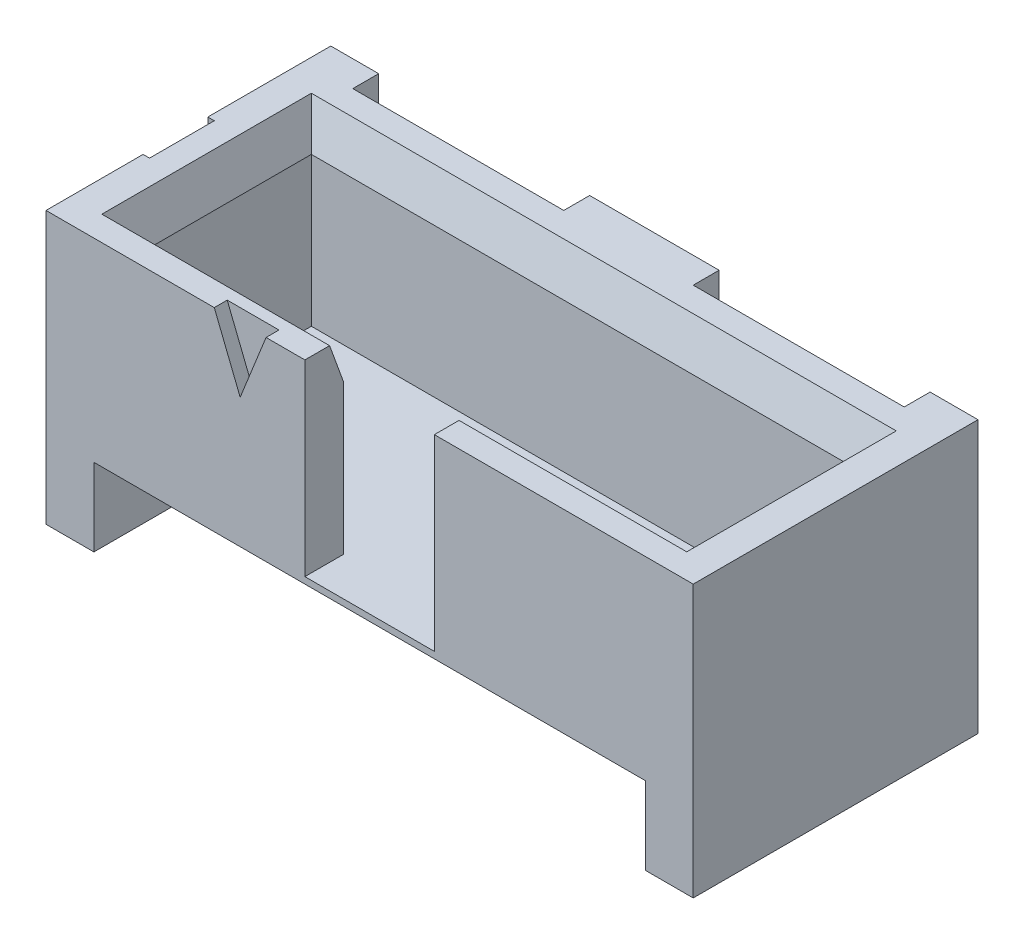
ISO-10303-21;
HEADER;
FILE_DESCRIPTION(('STEP AP214'),'2;1');
FILE_NAME('part.step','',(''),(''),'','','');
FILE_SCHEMA(('AUTOMOTIVE_DESIGN { 1 0 10303 214 1 1 1 1 }'));
ENDSEC;
DATA;
#1=APPLICATION_CONTEXT('core data for automotive mechanical design processes');
#2=APPLICATION_PROTOCOL_DEFINITION('international standard','automotive_design',2000,#1);
#3=PRODUCT_CONTEXT('',#1,'mechanical');
#4=PRODUCT('Part','Part','',(#3));
#5=PRODUCT_RELATED_PRODUCT_CATEGORY('part','',(#4));
#6=PRODUCT_DEFINITION_FORMATION('','',#4);
#7=PRODUCT_DEFINITION_CONTEXT('part definition',#1,'design');
#8=PRODUCT_DEFINITION('design','',#6,#7);
#9=PRODUCT_DEFINITION_SHAPE('','',#8);
#10=(LENGTH_UNIT() NAMED_UNIT(*) SI_UNIT(.MILLI.,.METRE.));
#11=(NAMED_UNIT(*) PLANE_ANGLE_UNIT() SI_UNIT($,.RADIAN.));
#12=(NAMED_UNIT(*) SI_UNIT($,.STERADIAN.) SOLID_ANGLE_UNIT());
#13=UNCERTAINTY_MEASURE_WITH_UNIT(LENGTH_MEASURE(1.E-05),#10,'distance_accuracy_value','');
#14=(GEOMETRIC_REPRESENTATION_CONTEXT(3) GLOBAL_UNCERTAINTY_ASSIGNED_CONTEXT((#13)) GLOBAL_UNIT_ASSIGNED_CONTEXT((#10,
#11,#12)) REPRESENTATION_CONTEXT('',''));
#15=CARTESIAN_POINT('',(0.,0.,0.));
#16=DIRECTION('',(0.,0.,1.));
#17=DIRECTION('',(1.,0.,0.));
#18=AXIS2_PLACEMENT_3D('',#15,#16,#17);
#19=CARTESIAN_POINT('',(-1.27,5.334,-3.048));
#20=DIRECTION('',(1.,0.,0.));
#21=DIRECTION('',(0.,0.,-1.));
#22=AXIS2_PLACEMENT_3D('',#19,#20,#21);
#23=PLANE('',#22);
#24=DIRECTION('',(0.,-0.707106781186548,0.707106781186548));
#25=VECTOR('',#24,1.);
#26=CARTESIAN_POINT('',(-1.27,2.032,-3.048));
#27=LINE('',#26,#25);
#28=CARTESIAN_POINT('',(-1.27,2.032,-3.048));
#29=VERTEX_POINT('',#28);
#30=CARTESIAN_POINT('',(-1.27,1.524,-2.54));
#31=VERTEX_POINT('',#30);
#32=EDGE_CURVE('E11',#29,#31,#27,.T.);
#33=ORIENTED_EDGE('',*,*,#32,.T.);
#34=DIRECTION('',(0.,-1.,0.));
#35=VECTOR('',#34,1.);
#36=CARTESIAN_POINT('',(-1.27,5.334,-2.54));
#37=LINE('',#36,#35);
#38=CARTESIAN_POINT('',(-1.27,5.334,-2.54));
#39=VERTEX_POINT('',#38);
#40=EDGE_CURVE('E23',#39,#31,#37,.T.);
#41=ORIENTED_EDGE('',*,*,#40,.F.);
#42=DIRECTION('',(0.,0.,1.));
#43=VECTOR('',#42,1.);
#44=CARTESIAN_POINT('',(-1.27,5.334,-3.048));
#45=LINE('',#44,#43);
#46=CARTESIAN_POINT('',(-1.27,5.334,-3.048));
#47=VERTEX_POINT('',#46);
#48=EDGE_CURVE('E514',#47,#39,#45,.T.);
#49=ORIENTED_EDGE('',*,*,#48,.F.);
#50=DIRECTION('',(0.,-1.,0.));
#51=VECTOR('',#50,1.);
#52=CARTESIAN_POINT('',(-1.27,5.334,-3.048));
#53=LINE('',#52,#51);
#54=EDGE_CURVE('E512',#47,#29,#53,.T.);
#55=ORIENTED_EDGE('',*,*,#54,.T.);
#56=EDGE_LOOP('',(#33,#41,#49,#55));
#57=FACE_BOUND('',#56,.T.);
#58=ADVANCED_FACE('F16',(#57),#23,.F.);
#59=CARTESIAN_POINT('',(0.,0.,-3.048));
#60=DIRECTION('',(0.,0.,1.));
#61=DIRECTION('',(1.,0.,0.));
#62=AXIS2_PLACEMENT_3D('',#59,#60,#61);
#63=PLANE('',#62);
#64=DIRECTION('',(-1.,0.,0.));
#65=VECTOR('',#64,1.);
#66=CARTESIAN_POINT('',(5.4102,2.032,-3.048));
#67=LINE('',#66,#65);
#68=CARTESIAN_POINT('',(1.27,2.032,-3.048));
#69=VERTEX_POINT('',#68);
#70=EDGE_CURVE('E509',#69,#29,#67,.T.);
#71=ORIENTED_EDGE('',*,*,#70,.T.);
#72=ORIENTED_EDGE('',*,*,#54,.F.);
#73=DIRECTION('',(-1.,0.,0.));
#74=VECTOR('',#73,1.);
#75=CARTESIAN_POINT('',(6.35,5.334,-3.048));
#76=LINE('',#75,#74);
#77=CARTESIAN_POINT('',(1.27,5.334,-3.048));
#78=VERTEX_POINT('',#77);
#79=EDGE_CURVE('E506',#78,#47,#76,.T.);
#80=ORIENTED_EDGE('',*,*,#79,.F.);
#81=DIRECTION('',(0.,-1.,0.));
#82=VECTOR('',#81,1.);
#83=CARTESIAN_POINT('',(1.27,5.334,-3.048));
#84=LINE('',#83,#82);
#85=EDGE_CURVE('E503',#78,#69,#84,.T.);
#86=ORIENTED_EDGE('',*,*,#85,.T.);
#87=EDGE_LOOP('',(#71,#72,#80,#86));
#88=FACE_BOUND('',#87,.T.);
#89=ADVANCED_FACE('F641',(#88),#63,.F.);
#90=CARTESIAN_POINT('',(1.27,5.334,-2.54));
#91=DIRECTION('',(-1.,0.,0.));
#92=DIRECTION('',(0.,0.,1.));
#93=AXIS2_PLACEMENT_3D('',#90,#91,#92);
#94=PLANE('',#93);
#95=DIRECTION('',(0.,0.707106781186548,-0.707106781186548));
#96=VECTOR('',#95,1.);
#97=CARTESIAN_POINT('',(1.27,2.032,-3.048));
#98=LINE('',#97,#96);
#99=CARTESIAN_POINT('',(1.27,1.524,-2.54));
#100=VERTEX_POINT('',#99);
#101=EDGE_CURVE('E500',#100,#69,#98,.T.);
#102=ORIENTED_EDGE('',*,*,#101,.T.);
#103=ORIENTED_EDGE('',*,*,#85,.F.);
#104=DIRECTION('',(0.,0.,-1.));
#105=VECTOR('',#104,1.);
#106=CARTESIAN_POINT('',(1.27,5.334,-2.54));
#107=LINE('',#106,#105);
#108=CARTESIAN_POINT('',(1.27,5.334,-2.54));
#109=VERTEX_POINT('',#108);
#110=EDGE_CURVE('E497',#109,#78,#107,.T.);
#111=ORIENTED_EDGE('',*,*,#110,.F.);
#112=DIRECTION('',(0.,-1.,0.));
#113=VECTOR('',#112,1.);
#114=CARTESIAN_POINT('',(1.27,5.334,-2.54));
#115=LINE('',#114,#113);
#116=EDGE_CURVE('E494',#109,#100,#115,.T.);
#117=ORIENTED_EDGE('',*,*,#116,.T.);
#118=EDGE_LOOP('',(#102,#103,#111,#117));
#119=FACE_BOUND('',#118,.T.);
#120=ADVANCED_FACE('F645',(#119),#94,.F.);
#121=CARTESIAN_POINT('',(5.4102,5.334,-2.54));
#122=DIRECTION('',(0.,0.,1.));
#123=DIRECTION('',(1.,0.,0.));
#124=AXIS2_PLACEMENT_3D('',#121,#122,#123);
#125=PLANE('',#124);
#126=DIRECTION('',(-1.,0.,0.));
#127=VECTOR('',#126,1.);
#128=CARTESIAN_POINT('',(5.4102,1.524,-2.54));
#129=LINE('',#128,#127);
#130=CARTESIAN_POINT('',(5.4102,1.524,-2.54));
#131=VERTEX_POINT('',#130);
#132=EDGE_CURVE('E491',#131,#100,#129,.T.);
#133=ORIENTED_EDGE('',*,*,#132,.T.);
#134=ORIENTED_EDGE('',*,*,#116,.F.);
#135=DIRECTION('',(-1.,0.,0.));
#136=VECTOR('',#135,1.);
#137=CARTESIAN_POINT('',(5.4102,5.334,-2.54));
#138=LINE('',#137,#136);
#139=CARTESIAN_POINT('',(5.4102,5.334,-2.54));
#140=VERTEX_POINT('',#139);
#141=EDGE_CURVE('E488',#140,#109,#138,.T.);
#142=ORIENTED_EDGE('',*,*,#141,.F.);
#143=DIRECTION('',(0.,-1.,0.));
#144=VECTOR('',#143,1.);
#145=CARTESIAN_POINT('',(5.4102,5.334,-2.54));
#146=LINE('',#145,#144);
#147=EDGE_CURVE('E485',#140,#131,#146,.T.);
#148=ORIENTED_EDGE('',*,*,#147,.T.);
#149=EDGE_LOOP('',(#133,#134,#142,#148));
#150=FACE_BOUND('',#149,.T.);
#151=ADVANCED_FACE('F638',(#150),#125,.F.);
#152=CARTESIAN_POINT('',(5.4102,0.,0.));
#153=DIRECTION('',(1.,0.,0.));
#154=DIRECTION('',(0.,0.,-1.));
#155=AXIS2_PLACEMENT_3D('',#152,#153,#154);
#156=PLANE('',#155);
#157=DIRECTION('',(0.,-0.707106781186548,0.707106781186548));
#158=VECTOR('',#157,1.);
#159=CARTESIAN_POINT('',(5.4102,2.032,-3.048));
#160=LINE('',#159,#158);
#161=CARTESIAN_POINT('',(5.4102,0.508,-1.524));
#162=VERTEX_POINT('',#161);
#163=EDGE_CURVE('E483',#131,#162,#160,.T.);
#164=ORIENTED_EDGE('',*,*,#163,.F.);
#165=ORIENTED_EDGE('',*,*,#147,.F.);
#166=DIRECTION('',(0.,0.,1.));
#167=VECTOR('',#166,1.);
#168=CARTESIAN_POINT('',(5.4102,5.334,-3.048));
#169=LINE('',#168,#167);
#170=CARTESIAN_POINT('',(5.4102,5.334,-3.048));
#171=VERTEX_POINT('',#170);
#172=EDGE_CURVE('E480',#171,#140,#169,.T.);
#173=ORIENTED_EDGE('',*,*,#172,.F.);
#174=DIRECTION('',(0.,1.,0.));
#175=VECTOR('',#174,1.);
#176=CARTESIAN_POINT('',(5.4102,0.,-3.048));
#177=LINE('',#176,#175);
#178=CARTESIAN_POINT('',(5.4102,0.,-3.048));
#179=VERTEX_POINT('',#178);
#180=EDGE_CURVE('E477',#179,#171,#177,.T.);
#181=ORIENTED_EDGE('',*,*,#180,.F.);
#182=DIRECTION('',(0.,0.,-1.));
#183=VECTOR('',#182,1.);
#184=CARTESIAN_POINT('',(5.4102,0.,2.54));
#185=LINE('',#184,#183);
#186=CARTESIAN_POINT('',(5.4102,0.,2.54));
#187=VERTEX_POINT('',#186);
#188=EDGE_CURVE('E474',#187,#179,#185,.T.);
#189=ORIENTED_EDGE('',*,*,#188,.F.);
#190=DIRECTION('',(0.,-1.,0.));
#191=VECTOR('',#190,1.);
#192=CARTESIAN_POINT('',(5.4102,1.524,2.54));
#193=LINE('',#192,#191);
#194=CARTESIAN_POINT('',(5.4102,1.524,2.54));
#195=VERTEX_POINT('',#194);
#196=EDGE_CURVE('E471',#195,#187,#193,.T.);
#197=ORIENTED_EDGE('',*,*,#196,.F.);
#198=DIRECTION('',(0.,0.707106781186547,0.707106781186548));
#199=VECTOR('',#198,1.);
#200=CARTESIAN_POINT('',(5.4102,0.508,1.524));
#201=LINE('',#200,#199);
#202=CARTESIAN_POINT('',(5.4102,0.508,1.524));
#203=VERTEX_POINT('',#202);
#204=EDGE_CURVE('E468',#203,#195,#201,.T.);
#205=ORIENTED_EDGE('',*,*,#204,.F.);
#206=DIRECTION('',(0.,0.,1.));
#207=VECTOR('',#206,1.);
#208=CARTESIAN_POINT('',(5.4102,0.508,-1.524));
#209=LINE('',#208,#207);
#210=EDGE_CURVE('E465',#162,#203,#209,.T.);
#211=ORIENTED_EDGE('',*,*,#210,.F.);
#212=EDGE_LOOP('',(#164,#165,#173,#181,#189,#197,#205,#211));
#213=FACE_BOUND('',#212,.T.);
#214=ADVANCED_FACE('F620',(#213),#156,.F.);
#215=CARTESIAN_POINT('',(5.4102,0.508,-1.524));
#216=DIRECTION('',(0.,-1.,0.));
#217=DIRECTION('',(0.,0.,-1.));
#218=AXIS2_PLACEMENT_3D('',#215,#216,#217);
#219=PLANE('',#218);
#220=DIRECTION('',(0.,0.,1.));
#221=VECTOR('',#220,1.);
#222=CARTESIAN_POINT('',(-5.4102,0.508,-1.524));
#223=LINE('',#222,#221);
#224=CARTESIAN_POINT('',(-5.4102,0.508,-1.524));
#225=VERTEX_POINT('',#224);
#226=CARTESIAN_POINT('',(-5.4102,0.508,1.524));
#227=VERTEX_POINT('',#226);
#228=EDGE_CURVE('E463',#225,#227,#223,.T.);
#229=ORIENTED_EDGE('',*,*,#228,.F.);
#230=DIRECTION('',(-1.,0.,0.));
#231=VECTOR('',#230,1.);
#232=CARTESIAN_POINT('',(5.4102,0.508,-1.524));
#233=LINE('',#232,#231);
#234=EDGE_CURVE('E460',#162,#225,#233,.T.);
#235=ORIENTED_EDGE('',*,*,#234,.F.);
#236=ORIENTED_EDGE('',*,*,#210,.T.);
#237=DIRECTION('',(-1.,0.,0.));
#238=VECTOR('',#237,1.);
#239=CARTESIAN_POINT('',(5.4102,0.508,1.524));
#240=LINE('',#239,#238);
#241=EDGE_CURVE('E457',#203,#227,#240,.T.);
#242=ORIENTED_EDGE('',*,*,#241,.T.);
#243=EDGE_LOOP('',(#229,#235,#236,#242));
#244=FACE_BOUND('',#243,.T.);
#245=ADVANCED_FACE('F629',(#244),#219,.T.);
#246=CARTESIAN_POINT('',(5.4102,0.508,1.524));
#247=DIRECTION('',(0.,-0.707106781186548,0.707106781186548));
#248=DIRECTION('',(0.,-0.707106781186548,-0.707106781186548));
#249=AXIS2_PLACEMENT_3D('',#246,#247,#248);
#250=PLANE('',#249);
#251=DIRECTION('',(0.,0.707106781186547,0.707106781186548));
#252=VECTOR('',#251,1.);
#253=CARTESIAN_POINT('',(-5.4102,0.508,1.524));
#254=LINE('',#253,#252);
#255=CARTESIAN_POINT('',(-5.4102,1.524,2.54));
#256=VERTEX_POINT('',#255);
#257=EDGE_CURVE('E455',#227,#256,#254,.T.);
#258=ORIENTED_EDGE('',*,*,#257,.F.);
#259=ORIENTED_EDGE('',*,*,#241,.F.);
#260=ORIENTED_EDGE('',*,*,#204,.T.);
#261=DIRECTION('',(-1.,0.,0.));
#262=VECTOR('',#261,1.);
#263=CARTESIAN_POINT('',(5.4102,1.524,2.54));
#264=LINE('',#263,#262);
#265=EDGE_CURVE('E452',#195,#256,#264,.T.);
#266=ORIENTED_EDGE('',*,*,#265,.T.);
#267=EDGE_LOOP('',(#258,#259,#260,#266));
#268=FACE_BOUND('',#267,.T.);
#269=ADVANCED_FACE('F625',(#268),#250,.T.);
#270=CARTESIAN_POINT('',(0.,0.,2.54));
#271=DIRECTION('',(0.,0.,1.));
#272=DIRECTION('',(1.,0.,0.));
#273=AXIS2_PLACEMENT_3D('',#270,#271,#272);
#274=PLANE('',#273);
#275=DIRECTION('',(0.371390676354104,-0.928476690885259,0.));
#276=VECTOR('',#275,1.);
#277=CARTESIAN_POINT('',(-3.048,5.334,2.54));
#278=LINE('',#277,#276);
#279=CARTESIAN_POINT('',(-3.048,5.334,2.54));
#280=VERTEX_POINT('',#279);
#281=CARTESIAN_POINT('',(-2.54,4.064,2.54));
#282=VERTEX_POINT('',#281);
#283=EDGE_CURVE('E450',#280,#282,#278,.T.);
#284=ORIENTED_EDGE('',*,*,#283,.F.);
#285=DIRECTION('',(-1.,0.,0.));
#286=VECTOR('',#285,1.);
#287=CARTESIAN_POINT('',(6.35,5.334,2.54));
#288=LINE('',#287,#286);
#289=CARTESIAN_POINT('',(-6.35,5.334,2.54));
#290=VERTEX_POINT('',#289);
#291=EDGE_CURVE('E448',#280,#290,#288,.T.);
#292=ORIENTED_EDGE('',*,*,#291,.T.);
#293=DIRECTION('',(0.,-1.,0.));
#294=VECTOR('',#293,1.);
#295=CARTESIAN_POINT('',(-6.35,5.334,2.54));
#296=LINE('',#295,#294);
#297=CARTESIAN_POINT('',(-6.35,0.,2.54));
#298=VERTEX_POINT('',#297);
#299=EDGE_CURVE('E446',#290,#298,#296,.T.);
#300=ORIENTED_EDGE('',*,*,#299,.T.);
#301=DIRECTION('',(1.,0.,0.));
#302=VECTOR('',#301,1.);
#303=CARTESIAN_POINT('',(-6.35,0.,2.54));
#304=LINE('',#303,#302);
#305=CARTESIAN_POINT('',(-5.4102,0.,2.54));
#306=VERTEX_POINT('',#305);
#307=EDGE_CURVE('E444',#298,#306,#304,.T.);
#308=ORIENTED_EDGE('',*,*,#307,.T.);
#309=DIRECTION('',(0.,-1.,0.));
#310=VECTOR('',#309,1.);
#311=CARTESIAN_POINT('',(-5.4102,1.524,2.54));
#312=LINE('',#311,#310);
#313=EDGE_CURVE('E441',#256,#306,#312,.T.);
#314=ORIENTED_EDGE('',*,*,#313,.F.);
#315=ORIENTED_EDGE('',*,*,#265,.F.);
#316=ORIENTED_EDGE('',*,*,#196,.T.);
#317=DIRECTION('',(1.,0.,0.));
#318=VECTOR('',#317,1.);
#319=CARTESIAN_POINT('',(-6.35,0.,2.54));
#320=LINE('',#319,#318);
#321=CARTESIAN_POINT('',(6.35,0.,2.54));
#322=VERTEX_POINT('',#321);
#323=EDGE_CURVE('E439',#187,#322,#320,.T.);
#324=ORIENTED_EDGE('',*,*,#323,.T.);
#325=DIRECTION('',(0.,1.,0.));
#326=VECTOR('',#325,1.);
#327=CARTESIAN_POINT('',(6.35,0.,2.54));
#328=LINE('',#327,#326);
#329=CARTESIAN_POINT('',(6.35,5.334,2.54));
#330=VERTEX_POINT('',#329);
#331=EDGE_CURVE('E437',#322,#330,#328,.T.);
#332=ORIENTED_EDGE('',*,*,#331,.T.);
#333=DIRECTION('',(-1.,0.,0.));
#334=VECTOR('',#333,1.);
#335=CARTESIAN_POINT('',(6.35,5.334,2.54));
#336=LINE('',#335,#334);
#337=CARTESIAN_POINT('',(1.27,5.334,2.54));
#338=VERTEX_POINT('',#337);
#339=EDGE_CURVE('E435',#330,#338,#336,.T.);
#340=ORIENTED_EDGE('',*,*,#339,.T.);
#341=DIRECTION('',(0.,1.,0.));
#342=VECTOR('',#341,1.);
#343=CARTESIAN_POINT('',(1.27,1.651,2.54));
#344=LINE('',#343,#342);
#345=CARTESIAN_POINT('',(1.27,1.651,2.54));
#346=VERTEX_POINT('',#345);
#347=EDGE_CURVE('E432',#346,#338,#344,.T.);
#348=ORIENTED_EDGE('',*,*,#347,.F.);
#349=DIRECTION('',(1.,0.,0.));
#350=VECTOR('',#349,1.);
#351=CARTESIAN_POINT('',(-1.27,1.651,2.54));
#352=LINE('',#351,#350);
#353=CARTESIAN_POINT('',(-1.27,1.651,2.54));
#354=VERTEX_POINT('',#353);
#355=EDGE_CURVE('E430',#354,#346,#352,.T.);
#356=ORIENTED_EDGE('',*,*,#355,.F.);
#357=DIRECTION('',(0.,-1.,0.));
#358=VECTOR('',#357,1.);
#359=CARTESIAN_POINT('',(-1.27,5.334,2.54));
#360=LINE('',#359,#358);
#361=CARTESIAN_POINT('',(-1.27,5.334,2.54));
#362=VERTEX_POINT('',#361);
#363=EDGE_CURVE('E427',#362,#354,#360,.T.);
#364=ORIENTED_EDGE('',*,*,#363,.F.);
#365=DIRECTION('',(-1.,0.,0.));
#366=VECTOR('',#365,1.);
#367=CARTESIAN_POINT('',(6.35,5.334,2.54));
#368=LINE('',#367,#366);
#369=CARTESIAN_POINT('',(-2.032,5.334,2.54));
#370=VERTEX_POINT('',#369);
#371=EDGE_CURVE('E425',#362,#370,#368,.T.);
#372=ORIENTED_EDGE('',*,*,#371,.T.);
#373=DIRECTION('',(0.371390676354104,0.928476690885259,0.));
#374=VECTOR('',#373,1.);
#375=CARTESIAN_POINT('',(-2.54,4.064,2.54));
#376=LINE('',#375,#374);
#377=EDGE_CURVE('E422',#282,#370,#376,.T.);
#378=ORIENTED_EDGE('',*,*,#377,.F.);
#379=EDGE_LOOP('',(#284,#292,#300,#308,#314,#315,#316,#324,#332,#340,#348,#356,#364,#372,#378));
#380=FACE_BOUND('',#379,.T.);
#381=ADVANCED_FACE('F571',(#380),#274,.T.);
#382=CARTESIAN_POINT('',(-2.54,4.064,2.286));
#383=DIRECTION('',(0.928476690885259,-0.371390676354104,0.));
#384=DIRECTION('',(0.371390676354104,0.928476690885259,0.));
#385=AXIS2_PLACEMENT_3D('',#382,#383,#384);
#386=PLANE('',#385);
#387=ORIENTED_EDGE('',*,*,#377,.T.);
#388=DIRECTION('',(0.,0.,1.));
#389=VECTOR('',#388,1.);
#390=CARTESIAN_POINT('',(-2.032,5.334,2.286));
#391=LINE('',#390,#389);
#392=CARTESIAN_POINT('',(-2.032,5.334,2.286));
#393=VERTEX_POINT('',#392);
#394=EDGE_CURVE('E419',#393,#370,#391,.T.);
#395=ORIENTED_EDGE('',*,*,#394,.F.);
#396=DIRECTION('',(0.371390676354104,0.928476690885259,0.));
#397=VECTOR('',#396,1.);
#398=CARTESIAN_POINT('',(-2.54,4.064,2.286));
#399=LINE('',#398,#397);
#400=CARTESIAN_POINT('',(-2.54,4.064,2.286));
#401=VERTEX_POINT('',#400);
#402=EDGE_CURVE('E416',#401,#393,#399,.T.);
#403=ORIENTED_EDGE('',*,*,#402,.F.);
#404=DIRECTION('',(0.,0.,1.));
#405=VECTOR('',#404,1.);
#406=CARTESIAN_POINT('',(-2.54,4.064,2.286));
#407=LINE('',#406,#405);
#408=EDGE_CURVE('E413',#401,#282,#407,.T.);
#409=ORIENTED_EDGE('',*,*,#408,.T.);
#410=EDGE_LOOP('',(#387,#395,#403,#409));
#411=FACE_BOUND('',#410,.T.);
#412=ADVANCED_FACE('F570',(#411),#386,.F.);
#413=CARTESIAN_POINT('',(-3.048,5.334,2.286));
#414=DIRECTION('',(-0.928476690885259,-0.371390676354104,0.));
#415=DIRECTION('',(0.371390676354104,-0.928476690885259,0.));
#416=AXIS2_PLACEMENT_3D('',#413,#414,#415);
#417=PLANE('',#416);
#418=ORIENTED_EDGE('',*,*,#283,.T.);
#419=ORIENTED_EDGE('',*,*,#408,.F.);
#420=DIRECTION('',(0.371390676354104,-0.928476690885259,0.));
#421=VECTOR('',#420,1.);
#422=CARTESIAN_POINT('',(-3.048,5.334,2.286));
#423=LINE('',#422,#421);
#424=CARTESIAN_POINT('',(-3.048,5.334,2.286));
#425=VERTEX_POINT('',#424);
#426=EDGE_CURVE('E410',#425,#401,#423,.T.);
#427=ORIENTED_EDGE('',*,*,#426,.F.);
#428=DIRECTION('',(0.,0.,1.));
#429=VECTOR('',#428,1.);
#430=CARTESIAN_POINT('',(-3.048,5.334,2.286));
#431=LINE('',#430,#429);
#432=EDGE_CURVE('E407',#425,#280,#431,.T.);
#433=ORIENTED_EDGE('',*,*,#432,.T.);
#434=EDGE_LOOP('',(#418,#419,#427,#433));
#435=FACE_BOUND('',#434,.T.);
#436=ADVANCED_FACE('F562',(#435),#417,.F.);
#437=CARTESIAN_POINT('',(6.35,5.334,2.54));
#438=DIRECTION('',(0.,-1.,0.));
#439=DIRECTION('',(0.,0.,-1.));
#440=AXIS2_PLACEMENT_3D('',#437,#438,#439);
#441=PLANE('',#440);
#442=DIRECTION('',(0.,0.,1.));
#443=VECTOR('',#442,1.);
#444=CARTESIAN_POINT('',(-6.223,5.334,-0.635));
#445=LINE('',#444,#443);
#446=CARTESIAN_POINT('',(-6.223,5.334,-0.635));
#447=VERTEX_POINT('',#446);
#448=CARTESIAN_POINT('',(-6.223,5.334,0.635));
#449=VERTEX_POINT('',#448);
#450=EDGE_CURVE('E405',#447,#449,#445,.T.);
#451=ORIENTED_EDGE('',*,*,#450,.T.);
#452=DIRECTION('',(-1.,0.,0.));
#453=VECTOR('',#452,1.);
#454=CARTESIAN_POINT('',(-6.223,5.334,0.635));
#455=LINE('',#454,#453);
#456=CARTESIAN_POINT('',(-6.35,5.334,0.635));
#457=VERTEX_POINT('',#456);
#458=EDGE_CURVE('E403',#449,#457,#455,.T.);
#459=ORIENTED_EDGE('',*,*,#458,.T.);
#460=DIRECTION('',(0.,0.,-1.));
#461=VECTOR('',#460,1.);
#462=CARTESIAN_POINT('',(-6.35,5.334,2.54));
#463=LINE('',#462,#461);
#464=EDGE_CURVE('E400',#290,#457,#463,.T.);
#465=ORIENTED_EDGE('',*,*,#464,.F.);
#466=ORIENTED_EDGE('',*,*,#291,.F.);
#467=ORIENTED_EDGE('',*,*,#432,.F.);
#468=DIRECTION('',(-1.,0.,0.));
#469=VECTOR('',#468,1.);
#470=CARTESIAN_POINT('',(-2.032,5.334,2.286));
#471=LINE('',#470,#469);
#472=EDGE_CURVE('E397',#393,#425,#471,.T.);
#473=ORIENTED_EDGE('',*,*,#472,.F.);
#474=ORIENTED_EDGE('',*,*,#394,.T.);
#475=ORIENTED_EDGE('',*,*,#371,.F.);
#476=DIRECTION('',(0.,0.,-1.));
#477=VECTOR('',#476,1.);
#478=CARTESIAN_POINT('',(-1.27,5.334,2.54));
#479=LINE('',#478,#477);
#480=CARTESIAN_POINT('',(-1.27,5.334,2.05534531851085));
#481=VERTEX_POINT('',#480);
#482=EDGE_CURVE('E395',#362,#481,#479,.T.);
#483=ORIENTED_EDGE('',*,*,#482,.T.);
#484=DIRECTION('',(1.,0.,0.));
#485=VECTOR('',#484,1.);
#486=CARTESIAN_POINT('',(-5.461,5.334,2.05534531851085));
#487=LINE('',#486,#485);
#488=CARTESIAN_POINT('',(-5.73834531851085,5.334,2.05534531851085));
#489=VERTEX_POINT('',#488);
#490=EDGE_CURVE('E392',#489,#481,#487,.T.);
#491=ORIENTED_EDGE('',*,*,#490,.F.);
#492=DIRECTION('',(0.,0.,1.));
#493=VECTOR('',#492,1.);
#494=CARTESIAN_POINT('',(-5.73834531851085,5.334,-1.778));
#495=LINE('',#494,#493);
#496=CARTESIAN_POINT('',(-5.73834531851085,5.334,-2.05534531851085));
#497=VERTEX_POINT('',#496);
#498=EDGE_CURVE('E389',#497,#489,#495,.T.);
#499=ORIENTED_EDGE('',*,*,#498,.F.);
#500=DIRECTION('',(-1.,0.,0.));
#501=VECTOR('',#500,1.);
#502=CARTESIAN_POINT('',(5.461,5.334,-2.05534531851085));
#503=LINE('',#502,#501);
#504=CARTESIAN_POINT('',(5.73834531851085,5.334,-2.05534531851085));
#505=VERTEX_POINT('',#504);
#506=EDGE_CURVE('E386',#505,#497,#503,.T.);
#507=ORIENTED_EDGE('',*,*,#506,.F.);
#508=DIRECTION('',(0.,0.,-1.));
#509=VECTOR('',#508,1.);
#510=CARTESIAN_POINT('',(5.73834531851085,5.334,1.778));
#511=LINE('',#510,#509);
#512=CARTESIAN_POINT('',(5.73834531851085,5.334,2.05534531851085));
#513=VERTEX_POINT('',#512);
#514=EDGE_CURVE('E383',#513,#505,#511,.T.);
#515=ORIENTED_EDGE('',*,*,#514,.F.);
#516=DIRECTION('',(1.,0.,0.));
#517=VECTOR('',#516,1.);
#518=CARTESIAN_POINT('',(-5.461,5.334,2.05534531851085));
#519=LINE('',#518,#517);
#520=CARTESIAN_POINT('',(1.27,5.334,2.05534531851085));
#521=VERTEX_POINT('',#520);
#522=EDGE_CURVE('E380',#521,#513,#519,.T.);
#523=ORIENTED_EDGE('',*,*,#522,.F.);
#524=DIRECTION('',(0.,0.,-1.));
#525=VECTOR('',#524,1.);
#526=CARTESIAN_POINT('',(1.27,5.334,2.54));
#527=LINE('',#526,#525);
#528=EDGE_CURVE('E377',#338,#521,#527,.T.);
#529=ORIENTED_EDGE('',*,*,#528,.F.);
#530=ORIENTED_EDGE('',*,*,#339,.F.);
#531=DIRECTION('',(0.,0.,-1.));
#532=VECTOR('',#531,1.);
#533=CARTESIAN_POINT('',(6.35,5.334,2.54));
#534=LINE('',#533,#532);
#535=CARTESIAN_POINT('',(6.35,5.334,-3.048));
#536=VERTEX_POINT('',#535);
#537=EDGE_CURVE('E375',#330,#536,#534,.T.);
#538=ORIENTED_EDGE('',*,*,#537,.T.);
#539=DIRECTION('',(-1.,0.,0.));
#540=VECTOR('',#539,1.);
#541=CARTESIAN_POINT('',(6.35,5.334,-3.048));
#542=LINE('',#541,#540);
#543=EDGE_CURVE('E372',#536,#171,#542,.T.);
#544=ORIENTED_EDGE('',*,*,#543,.T.);
#545=ORIENTED_EDGE('',*,*,#172,.T.);
#546=ORIENTED_EDGE('',*,*,#141,.T.);
#547=ORIENTED_EDGE('',*,*,#110,.T.);
#548=ORIENTED_EDGE('',*,*,#79,.T.);
#549=ORIENTED_EDGE('',*,*,#48,.T.);
#550=DIRECTION('',(-1.,0.,0.));
#551=VECTOR('',#550,1.);
#552=CARTESIAN_POINT('',(-1.27,5.334,-2.54));
#553=LINE('',#552,#551);
#554=CARTESIAN_POINT('',(-5.4102,5.334,-2.54));
#555=VERTEX_POINT('',#554);
#556=EDGE_CURVE('E370',#39,#555,#553,.T.);
#557=ORIENTED_EDGE('',*,*,#556,.T.);
#558=DIRECTION('',(0.,0.,-1.));
#559=VECTOR('',#558,1.);
#560=CARTESIAN_POINT('',(-5.4102,5.334,-2.54));
#561=LINE('',#560,#559);
#562=CARTESIAN_POINT('',(-5.4102,5.334,-3.048));
#563=VERTEX_POINT('',#562);
#564=EDGE_CURVE('E368',#555,#563,#561,.T.);
#565=ORIENTED_EDGE('',*,*,#564,.T.);
#566=DIRECTION('',(-1.,0.,0.));
#567=VECTOR('',#566,1.);
#568=CARTESIAN_POINT('',(6.35,5.334,-3.048));
#569=LINE('',#568,#567);
#570=CARTESIAN_POINT('',(-6.35,5.334,-3.048));
#571=VERTEX_POINT('',#570);
#572=EDGE_CURVE('E366',#563,#571,#569,.T.);
#573=ORIENTED_EDGE('',*,*,#572,.T.);
#574=DIRECTION('',(0.,0.,-1.));
#575=VECTOR('',#574,1.);
#576=CARTESIAN_POINT('',(-6.35,5.334,2.54));
#577=LINE('',#576,#575);
#578=CARTESIAN_POINT('',(-6.35,5.334,-0.635));
#579=VERTEX_POINT('',#578);
#580=EDGE_CURVE('E363',#579,#571,#577,.T.);
#581=ORIENTED_EDGE('',*,*,#580,.F.);
#582=DIRECTION('',(1.,0.,0.));
#583=VECTOR('',#582,1.);
#584=CARTESIAN_POINT('',(-6.604,5.334,-0.635));
#585=LINE('',#584,#583);
#586=EDGE_CURVE('E360',#579,#447,#585,.T.);
#587=ORIENTED_EDGE('',*,*,#586,.T.);
#588=EDGE_LOOP('',(#451,#459,#465,#466,#467,#473,#474,#475,#483,#491,#499,#507,#515,#523,#529,
#530,#538,#544,#545,#546,#547,#548,#549,#557,#565,#573,#581,#587));
#589=FACE_BOUND('',#588,.T.);
#590=ADVANCED_FACE('F528',(#589),#441,.F.);
#591=CARTESIAN_POINT('',(-6.604,5.334,-0.635));
#592=DIRECTION('',(0.,0.,-1.));
#593=DIRECTION('',(-1.,0.,0.));
#594=AXIS2_PLACEMENT_3D('',#591,#592,#593);
#595=PLANE('',#594);
#596=DIRECTION('',(1.,0.,0.));
#597=VECTOR('',#596,1.);
#598=CARTESIAN_POINT('',(-6.604,0.,-0.635));
#599=LINE('',#598,#597);
#600=CARTESIAN_POINT('',(-6.35,0.,-0.635));
#601=VERTEX_POINT('',#600);
#602=CARTESIAN_POINT('',(-6.223,0.,-0.635));
#603=VERTEX_POINT('',#602);
#604=EDGE_CURVE('E358',#601,#603,#599,.T.);
#605=ORIENTED_EDGE('',*,*,#604,.T.);
#606=DIRECTION('',(0.,-1.,0.));
#607=VECTOR('',#606,1.);
#608=CARTESIAN_POINT('',(-6.223,5.334,-0.635));
#609=LINE('',#608,#607);
#610=EDGE_CURVE('E355',#447,#603,#609,.T.);
#611=ORIENTED_EDGE('',*,*,#610,.F.);
#612=ORIENTED_EDGE('',*,*,#586,.F.);
#613=DIRECTION('',(0.,1.,0.));
#614=VECTOR('',#613,1.);
#615=CARTESIAN_POINT('',(-6.35,5.334,-0.635));
#616=LINE('',#615,#614);
#617=EDGE_CURVE('E352',#601,#579,#616,.T.);
#618=ORIENTED_EDGE('',*,*,#617,.F.);
#619=EDGE_LOOP('',(#605,#611,#612,#618));
#620=FACE_BOUND('',#619,.T.);
#621=ADVANCED_FACE('F540',(#620),#595,.F.);
#622=CARTESIAN_POINT('',(-6.35,5.334,2.54));
#623=DIRECTION('',(1.,0.,0.));
#624=DIRECTION('',(0.,0.,-1.));
#625=AXIS2_PLACEMENT_3D('',#622,#623,#624);
#626=PLANE('',#625);
#627=DIRECTION('',(0.,0.,-1.));
#628=VECTOR('',#627,1.);
#629=CARTESIAN_POINT('',(-6.35,0.,2.54));
#630=LINE('',#629,#628);
#631=CARTESIAN_POINT('',(-6.35,0.,-3.048));
#632=VERTEX_POINT('',#631);
#633=EDGE_CURVE('E350',#601,#632,#630,.T.);
#634=ORIENTED_EDGE('',*,*,#633,.F.);
#635=ORIENTED_EDGE('',*,*,#617,.T.);
#636=ORIENTED_EDGE('',*,*,#580,.T.);
#637=DIRECTION('',(0.,-1.,0.));
#638=VECTOR('',#637,1.);
#639=CARTESIAN_POINT('',(-6.35,5.334,-3.048));
#640=LINE('',#639,#638);
#641=EDGE_CURVE('E347',#571,#632,#640,.T.);
#642=ORIENTED_EDGE('',*,*,#641,.T.);
#643=EDGE_LOOP('',(#634,#635,#636,#642));
#644=FACE_BOUND('',#643,.T.);
#645=ADVANCED_FACE('F535',(#644),#626,.F.);
#646=CARTESIAN_POINT('',(0.,0.,-3.048));
#647=DIRECTION('',(0.,0.,1.));
#648=DIRECTION('',(1.,0.,0.));
#649=AXIS2_PLACEMENT_3D('',#646,#647,#648);
#650=PLANE('',#649);
#651=ORIENTED_EDGE('',*,*,#572,.F.);
#652=DIRECTION('',(0.,1.,0.));
#653=VECTOR('',#652,1.);
#654=CARTESIAN_POINT('',(-5.4102,0.,-3.048));
#655=LINE('',#654,#653);
#656=CARTESIAN_POINT('',(-5.4102,0.,-3.048));
#657=VERTEX_POINT('',#656);
#658=EDGE_CURVE('E344',#657,#563,#655,.T.);
#659=ORIENTED_EDGE('',*,*,#658,.F.);
#660=DIRECTION('',(1.,0.,0.));
#661=VECTOR('',#660,1.);
#662=CARTESIAN_POINT('',(-6.35,0.,-3.048));
#663=LINE('',#662,#661);
#664=EDGE_CURVE('E341',#632,#657,#663,.T.);
#665=ORIENTED_EDGE('',*,*,#664,.F.);
#666=ORIENTED_EDGE('',*,*,#641,.F.);
#667=EDGE_LOOP('',(#651,#659,#665,#666));
#668=FACE_BOUND('',#667,.T.);
#669=ADVANCED_FACE('F531',(#668),#650,.F.);
#670=CARTESIAN_POINT('',(-6.35,0.,2.54));
#671=DIRECTION('',(0.,1.,0.));
#672=DIRECTION('',(0.,0.,1.));
#673=AXIS2_PLACEMENT_3D('',#670,#671,#672);
#674=PLANE('',#673);
#675=DIRECTION('',(0.,0.,-1.));
#676=VECTOR('',#675,1.);
#677=CARTESIAN_POINT('',(-6.35,0.,2.54));
#678=LINE('',#677,#676);
#679=CARTESIAN_POINT('',(-6.35,0.,0.635));
#680=VERTEX_POINT('',#679);
#681=EDGE_CURVE('E339',#298,#680,#678,.T.);
#682=ORIENTED_EDGE('',*,*,#681,.T.);
#683=DIRECTION('',(-1.,0.,0.));
#684=VECTOR('',#683,1.);
#685=CARTESIAN_POINT('',(-6.223,0.,0.635));
#686=LINE('',#685,#684);
#687=CARTESIAN_POINT('',(-6.223,0.,0.635));
#688=VERTEX_POINT('',#687);
#689=EDGE_CURVE('E336',#688,#680,#686,.T.);
#690=ORIENTED_EDGE('',*,*,#689,.F.);
#691=DIRECTION('',(0.,0.,1.));
#692=VECTOR('',#691,1.);
#693=CARTESIAN_POINT('',(-6.223,0.,-0.635));
#694=LINE('',#693,#692);
#695=EDGE_CURVE('E333',#603,#688,#694,.T.);
#696=ORIENTED_EDGE('',*,*,#695,.F.);
#697=ORIENTED_EDGE('',*,*,#604,.F.);
#698=ORIENTED_EDGE('',*,*,#633,.T.);
#699=ORIENTED_EDGE('',*,*,#664,.T.);
#700=DIRECTION('',(0.,0.,-1.));
#701=VECTOR('',#700,1.);
#702=CARTESIAN_POINT('',(-5.4102,0.,2.54));
#703=LINE('',#702,#701);
#704=EDGE_CURVE('E330',#306,#657,#703,.T.);
#705=ORIENTED_EDGE('',*,*,#704,.F.);
#706=ORIENTED_EDGE('',*,*,#307,.F.);
#707=EDGE_LOOP('',(#682,#690,#696,#697,#698,#699,#705,#706));
#708=FACE_BOUND('',#707,.T.);
#709=ADVANCED_FACE('F546',(#708),#674,.F.);
#710=CARTESIAN_POINT('',(-5.4102,0.,0.));
#711=DIRECTION('',(1.,0.,0.));
#712=DIRECTION('',(0.,0.,-1.));
#713=AXIS2_PLACEMENT_3D('',#710,#711,#712);
#714=PLANE('',#713);
#715=ORIENTED_EDGE('',*,*,#704,.T.);
#716=ORIENTED_EDGE('',*,*,#658,.T.);
#717=ORIENTED_EDGE('',*,*,#564,.F.);
#718=DIRECTION('',(0.,-1.,0.));
#719=VECTOR('',#718,1.);
#720=CARTESIAN_POINT('',(-5.4102,5.334,-2.54));
#721=LINE('',#720,#719);
#722=CARTESIAN_POINT('',(-5.4102,1.524,-2.54));
#723=VERTEX_POINT('',#722);
#724=EDGE_CURVE('E328',#555,#723,#721,.T.);
#725=ORIENTED_EDGE('',*,*,#724,.T.);
#726=DIRECTION('',(0.,-0.707106781186548,0.707106781186548));
#727=VECTOR('',#726,1.);
#728=CARTESIAN_POINT('',(-5.4102,2.032,-3.048));
#729=LINE('',#728,#727);
#730=EDGE_CURVE('E325',#723,#225,#729,.T.);
#731=ORIENTED_EDGE('',*,*,#730,.T.);
#732=ORIENTED_EDGE('',*,*,#228,.T.);
#733=ORIENTED_EDGE('',*,*,#257,.T.);
#734=ORIENTED_EDGE('',*,*,#313,.T.);
#735=EDGE_LOOP('',(#715,#716,#717,#725,#731,#732,#733,#734));
#736=FACE_BOUND('',#735,.T.);
#737=ADVANCED_FACE('F524',(#736),#714,.T.);
#738=CARTESIAN_POINT('',(5.4102,2.032,-3.048));
#739=DIRECTION('',(0.,-0.707106781186548,-0.707106781186548));
#740=DIRECTION('',(0.,0.707106781186548,-0.707106781186548));
#741=AXIS2_PLACEMENT_3D('',#738,#739,#740);
#742=PLANE('',#741);
#743=DIRECTION('',(-1.,0.,0.));
#744=VECTOR('',#743,1.);
#745=CARTESIAN_POINT('',(5.4102,1.524,-2.54));
#746=LINE('',#745,#744);
#747=EDGE_CURVE('E322',#31,#723,#746,.T.);
#748=ORIENTED_EDGE('',*,*,#747,.F.);
#749=ORIENTED_EDGE('',*,*,#32,.F.);
#750=ORIENTED_EDGE('',*,*,#70,.F.);
#751=ORIENTED_EDGE('',*,*,#101,.F.);
#752=ORIENTED_EDGE('',*,*,#132,.F.);
#753=ORIENTED_EDGE('',*,*,#163,.T.);
#754=ORIENTED_EDGE('',*,*,#234,.T.);
#755=ORIENTED_EDGE('',*,*,#730,.F.);
#756=EDGE_LOOP('',(#748,#749,#750,#751,#752,#753,#754,#755));
#757=FACE_BOUND('',#756,.T.);
#758=ADVANCED_FACE('F521',(#757),#742,.T.);
#759=CARTESIAN_POINT('',(-1.27,5.334,-2.54));
#760=DIRECTION('',(0.,0.,1.));
#761=DIRECTION('',(1.,0.,0.));
#762=AXIS2_PLACEMENT_3D('',#759,#760,#761);
#763=PLANE('',#762);
#764=ORIENTED_EDGE('',*,*,#747,.T.);
#765=ORIENTED_EDGE('',*,*,#724,.F.);
#766=ORIENTED_EDGE('',*,*,#556,.F.);
#767=ORIENTED_EDGE('',*,*,#40,.T.);
#768=EDGE_LOOP('',(#764,#765,#766,#767));
#769=FACE_BOUND('',#768,.T.);
#770=ADVANCED_FACE('F518',(#769),#763,.F.);
#771=CARTESIAN_POINT('',(-6.223,5.334,-0.635));
#772=DIRECTION('',(1.,0.,0.));
#773=DIRECTION('',(0.,0.,-1.));
#774=AXIS2_PLACEMENT_3D('',#771,#772,#773);
#775=PLANE('',#774);
#776=ORIENTED_EDGE('',*,*,#695,.T.);
#777=DIRECTION('',(0.,-1.,0.));
#778=VECTOR('',#777,1.);
#779=CARTESIAN_POINT('',(-6.223,5.334,0.635));
#780=LINE('',#779,#778);
#781=EDGE_CURVE('E319',#449,#688,#780,.T.);
#782=ORIENTED_EDGE('',*,*,#781,.F.);
#783=ORIENTED_EDGE('',*,*,#450,.F.);
#784=ORIENTED_EDGE('',*,*,#610,.T.);
#785=EDGE_LOOP('',(#776,#782,#783,#784));
#786=FACE_BOUND('',#785,.T.);
#787=ADVANCED_FACE('F543',(#786),#775,.F.);
#788=CARTESIAN_POINT('',(-6.223,5.334,0.635));
#789=DIRECTION('',(0.,0.,1.));
#790=DIRECTION('',(1.,0.,0.));
#791=AXIS2_PLACEMENT_3D('',#788,#789,#790);
#792=PLANE('',#791);
#793=ORIENTED_EDGE('',*,*,#458,.F.);
#794=ORIENTED_EDGE('',*,*,#781,.T.);
#795=ORIENTED_EDGE('',*,*,#689,.T.);
#796=DIRECTION('',(0.,-1.,0.));
#797=VECTOR('',#796,1.);
#798=CARTESIAN_POINT('',(-6.35,5.334,0.635));
#799=LINE('',#798,#797);
#800=EDGE_CURVE('E316',#457,#680,#799,.T.);
#801=ORIENTED_EDGE('',*,*,#800,.F.);
#802=EDGE_LOOP('',(#793,#794,#795,#801));
#803=FACE_BOUND('',#802,.T.);
#804=ADVANCED_FACE('F552',(#803),#792,.F.);
#805=CARTESIAN_POINT('',(-6.35,5.334,2.54));
#806=DIRECTION('',(1.,0.,0.));
#807=DIRECTION('',(0.,0.,-1.));
#808=AXIS2_PLACEMENT_3D('',#805,#806,#807);
#809=PLANE('',#808);
#810=ORIENTED_EDGE('',*,*,#464,.T.);
#811=ORIENTED_EDGE('',*,*,#800,.T.);
#812=ORIENTED_EDGE('',*,*,#681,.F.);
#813=ORIENTED_EDGE('',*,*,#299,.F.);
#814=EDGE_LOOP('',(#810,#811,#812,#813));
#815=FACE_BOUND('',#814,.T.);
#816=ADVANCED_FACE('F554',(#815),#809,.F.);
#817=CARTESIAN_POINT('',(0.,0.,-3.048));
#818=DIRECTION('',(0.,0.,1.));
#819=DIRECTION('',(1.,0.,0.));
#820=AXIS2_PLACEMENT_3D('',#817,#818,#819);
#821=PLANE('',#820);
#822=ORIENTED_EDGE('',*,*,#180,.T.);
#823=ORIENTED_EDGE('',*,*,#543,.F.);
#824=DIRECTION('',(0.,1.,0.));
#825=VECTOR('',#824,1.);
#826=CARTESIAN_POINT('',(6.35,0.,-3.048));
#827=LINE('',#826,#825);
#828=CARTESIAN_POINT('',(6.35,0.,-3.048));
#829=VERTEX_POINT('',#828);
#830=EDGE_CURVE('E313',#829,#536,#827,.T.);
#831=ORIENTED_EDGE('',*,*,#830,.F.);
#832=DIRECTION('',(1.,0.,0.));
#833=VECTOR('',#832,1.);
#834=CARTESIAN_POINT('',(-6.35,0.,-3.048));
#835=LINE('',#834,#833);
#836=EDGE_CURVE('E310',#179,#829,#835,.T.);
#837=ORIENTED_EDGE('',*,*,#836,.F.);
#838=EDGE_LOOP('',(#822,#823,#831,#837));
#839=FACE_BOUND('',#838,.T.);
#840=ADVANCED_FACE('F614',(#839),#821,.F.);
#841=CARTESIAN_POINT('',(-6.35,0.,2.54));
#842=DIRECTION('',(0.,1.,0.));
#843=DIRECTION('',(0.,0.,1.));
#844=AXIS2_PLACEMENT_3D('',#841,#842,#843);
#845=PLANE('',#844);
#846=ORIENTED_EDGE('',*,*,#323,.F.);
#847=ORIENTED_EDGE('',*,*,#188,.T.);
#848=ORIENTED_EDGE('',*,*,#836,.T.);
#849=DIRECTION('',(0.,0.,-1.));
#850=VECTOR('',#849,1.);
#851=CARTESIAN_POINT('',(6.35,0.,2.54));
#852=LINE('',#851,#850);
#853=EDGE_CURVE('E307',#322,#829,#852,.T.);
#854=ORIENTED_EDGE('',*,*,#853,.F.);
#855=EDGE_LOOP('',(#846,#847,#848,#854));
#856=FACE_BOUND('',#855,.T.);
#857=ADVANCED_FACE('F617',(#856),#845,.F.);
#858=CARTESIAN_POINT('',(6.35,0.,2.54));
#859=DIRECTION('',(-1.,0.,0.));
#860=DIRECTION('',(0.,0.,1.));
#861=AXIS2_PLACEMENT_3D('',#858,#859,#860);
#862=PLANE('',#861);
#863=ORIENTED_EDGE('',*,*,#830,.T.);
#864=ORIENTED_EDGE('',*,*,#537,.F.);
#865=ORIENTED_EDGE('',*,*,#331,.F.);
#866=ORIENTED_EDGE('',*,*,#853,.T.);
#867=EDGE_LOOP('',(#863,#864,#865,#866));
#868=FACE_BOUND('',#867,.T.);
#869=ADVANCED_FACE('F610',(#868),#862,.F.);
#870=CARTESIAN_POINT('',(1.27,1.651,2.54));
#871=DIRECTION('',(-1.,0.,0.));
#872=DIRECTION('',(0.,0.,1.));
#873=AXIS2_PLACEMENT_3D('',#870,#871,#872);
#874=PLANE('',#873);
#875=DIRECTION('',(0.,1.,0.));
#876=VECTOR('',#875,1.);
#877=CARTESIAN_POINT('',(1.27,1.651,1.778));
#878=LINE('',#877,#876);
#879=CARTESIAN_POINT('',(1.27,1.651,1.778));
#880=VERTEX_POINT('',#879);
#881=CARTESIAN_POINT('',(1.27,4.572,1.778));
#882=VERTEX_POINT('',#881);
#883=EDGE_CURVE('E305',#880,#882,#878,.T.);
#884=ORIENTED_EDGE('',*,*,#883,.F.);
#885=DIRECTION('',(0.,0.,-1.));
#886=VECTOR('',#885,1.);
#887=CARTESIAN_POINT('',(1.27,1.651,2.54));
#888=LINE('',#887,#886);
#889=EDGE_CURVE('E256',#346,#880,#888,.T.);
#890=ORIENTED_EDGE('',*,*,#889,.F.);
#891=ORIENTED_EDGE('',*,*,#347,.T.);
#892=ORIENTED_EDGE('',*,*,#528,.T.);
#893=DIRECTION('',(0.,0.939692620785908,0.342020143325669));
#894=VECTOR('',#893,1.);
#895=CARTESIAN_POINT('',(1.27,4.572,1.778));
#896=LINE('',#895,#894);
#897=EDGE_CURVE('E301',#882,#521,#896,.T.);
#898=ORIENTED_EDGE('',*,*,#897,.F.);
#899=EDGE_LOOP('',(#884,#890,#891,#892,#898));
#900=FACE_BOUND('',#899,.T.);
#901=ADVANCED_FACE('F604',(#900),#874,.T.);
#902=CARTESIAN_POINT('',(-5.461,4.572,1.778));
#903=DIRECTION('',(0.,0.342020143325669,-0.939692620785908));
#904=DIRECTION('',(0.,0.939692620785908,0.342020143325669));
#905=AXIS2_PLACEMENT_3D('',#902,#903,#904);
#906=PLANE('',#905);
#907=DIRECTION('',(1.,0.,0.));
#908=VECTOR('',#907,1.);
#909=CARTESIAN_POINT('',(-5.461,4.572,1.778));
#910=LINE('',#909,#908);
#911=CARTESIAN_POINT('',(5.461,4.572,1.778));
#912=VERTEX_POINT('',#911);
#913=EDGE_CURVE('E248',#882,#912,#910,.T.);
#914=ORIENTED_EDGE('',*,*,#913,.F.);
#915=ORIENTED_EDGE('',*,*,#897,.T.);
#916=ORIENTED_EDGE('',*,*,#522,.T.);
#917=DIRECTION('',(-0.323615577118185,-0.889126490715988,-0.323615577118185));
#918=VECTOR('',#917,1.);
#919=CARTESIAN_POINT('',(5.461,4.572,1.778));
#920=LINE('',#919,#918);
#921=EDGE_CURVE('E298',#513,#912,#920,.T.);
#922=ORIENTED_EDGE('',*,*,#921,.T.);
#923=EDGE_LOOP('',(#914,#915,#916,#922));
#924=FACE_BOUND('',#923,.T.);
#925=ADVANCED_FACE('F601',(#924),#906,.T.);
#926=CARTESIAN_POINT('',(5.461,4.572,1.778));
#927=DIRECTION('',(-0.939692620785908,0.342020143325669,0.));
#928=DIRECTION('',(-0.342020143325669,-0.939692620785908,0.));
#929=AXIS2_PLACEMENT_3D('',#926,#927,#928);
#930=PLANE('',#929);
#931=DIRECTION('',(0.,0.,-1.));
#932=VECTOR('',#931,1.);
#933=CARTESIAN_POINT('',(5.461,4.572,1.778));
#934=LINE('',#933,#932);
#935=CARTESIAN_POINT('',(5.461,4.572,-1.778));
#936=VERTEX_POINT('',#935);
#937=EDGE_CURVE('E296',#912,#936,#934,.T.);
#938=ORIENTED_EDGE('',*,*,#937,.F.);
#939=ORIENTED_EDGE('',*,*,#921,.F.);
#940=ORIENTED_EDGE('',*,*,#514,.T.);
#941=DIRECTION('',(-0.323615577118185,-0.889126490715988,0.323615577118185));
#942=VECTOR('',#941,1.);
#943=CARTESIAN_POINT('',(5.461,4.572,-1.778));
#944=LINE('',#943,#942);
#945=EDGE_CURVE('E293',#505,#936,#944,.T.);
#946=ORIENTED_EDGE('',*,*,#945,.T.);
#947=EDGE_LOOP('',(#938,#939,#940,#946));
#948=FACE_BOUND('',#947,.T.);
#949=ADVANCED_FACE('F597',(#948),#930,.T.);
#950=CARTESIAN_POINT('',(5.461,4.572,-1.778));
#951=DIRECTION('',(0.,0.342020143325669,0.939692620785908));
#952=DIRECTION('',(0.,-0.939692620785908,0.342020143325669));
#953=AXIS2_PLACEMENT_3D('',#950,#951,#952);
#954=PLANE('',#953);
#955=DIRECTION('',(-1.,0.,0.));
#956=VECTOR('',#955,1.);
#957=CARTESIAN_POINT('',(5.461,4.572,-1.778));
#958=LINE('',#957,#956);
#959=CARTESIAN_POINT('',(-5.461,4.572,-1.778));
#960=VERTEX_POINT('',#959);
#961=EDGE_CURVE('E291',#936,#960,#958,.T.);
#962=ORIENTED_EDGE('',*,*,#961,.F.);
#963=ORIENTED_EDGE('',*,*,#945,.F.);
#964=ORIENTED_EDGE('',*,*,#506,.T.);
#965=DIRECTION('',(0.323615577118185,-0.889126490715988,0.323615577118185));
#966=VECTOR('',#965,1.);
#967=CARTESIAN_POINT('',(-5.461,4.572,-1.778));
#968=LINE('',#967,#966);
#969=EDGE_CURVE('E288',#497,#960,#968,.T.);
#970=ORIENTED_EDGE('',*,*,#969,.T.);
#971=EDGE_LOOP('',(#962,#963,#964,#970));
#972=FACE_BOUND('',#971,.T.);
#973=ADVANCED_FACE('F594',(#972),#954,.T.);
#974=CARTESIAN_POINT('',(-5.461,4.572,-1.778));
#975=DIRECTION('',(0.939692620785908,0.342020143325669,0.));
#976=DIRECTION('',(-0.342020143325669,0.939692620785908,0.));
#977=AXIS2_PLACEMENT_3D('',#974,#975,#976);
#978=PLANE('',#977);
#979=DIRECTION('',(0.,0.,1.));
#980=VECTOR('',#979,1.);
#981=CARTESIAN_POINT('',(-5.461,4.572,-1.778));
#982=LINE('',#981,#980);
#983=CARTESIAN_POINT('',(-5.461,4.572,1.778));
#984=VERTEX_POINT('',#983);
#985=EDGE_CURVE('E286',#960,#984,#982,.T.);
#986=ORIENTED_EDGE('',*,*,#985,.F.);
#987=ORIENTED_EDGE('',*,*,#969,.F.);
#988=ORIENTED_EDGE('',*,*,#498,.T.);
#989=DIRECTION('',(0.323615577118185,-0.889126490715988,-0.323615577118185));
#990=VECTOR('',#989,1.);
#991=CARTESIAN_POINT('',(-5.461,4.572,1.778));
#992=LINE('',#991,#990);
#993=EDGE_CURVE('E283',#489,#984,#992,.T.);
#994=ORIENTED_EDGE('',*,*,#993,.T.);
#995=EDGE_LOOP('',(#986,#987,#988,#994));
#996=FACE_BOUND('',#995,.T.);
#997=ADVANCED_FACE('F588',(#996),#978,.T.);
#998=CARTESIAN_POINT('',(-5.461,4.572,1.778));
#999=DIRECTION('',(0.,0.342020143325669,-0.939692620785908));
#1000=DIRECTION('',(0.,0.939692620785908,0.342020143325669));
#1001=AXIS2_PLACEMENT_3D('',#998,#999,#1000);
#1002=PLANE('',#1001);
#1003=ORIENTED_EDGE('',*,*,#490,.T.);
#1004=DIRECTION('',(0.,-0.939692620785908,-0.342020143325669));
#1005=VECTOR('',#1004,1.);
#1006=CARTESIAN_POINT('',(-1.27,4.572,1.778));
#1007=LINE('',#1006,#1005);
#1008=CARTESIAN_POINT('',(-1.27,4.572,1.778));
#1009=VERTEX_POINT('',#1008);
#1010=EDGE_CURVE('E281',#481,#1009,#1007,.T.);
#1011=ORIENTED_EDGE('',*,*,#1010,.T.);
#1012=DIRECTION('',(1.,0.,0.));
#1013=VECTOR('',#1012,1.);
#1014=CARTESIAN_POINT('',(-5.461,4.572,1.778));
#1015=LINE('',#1014,#1013);
#1016=EDGE_CURVE('E278',#984,#1009,#1015,.T.);
#1017=ORIENTED_EDGE('',*,*,#1016,.F.);
#1018=ORIENTED_EDGE('',*,*,#993,.F.);
#1019=EDGE_LOOP('',(#1003,#1011,#1017,#1018));
#1020=FACE_BOUND('',#1019,.T.);
#1021=ADVANCED_FACE('F590',(#1020),#1002,.T.);
#1022=CARTESIAN_POINT('',(-5.461,1.651,1.778));
#1023=DIRECTION('',(0.,0.,1.));
#1024=DIRECTION('',(1.,0.,0.));
#1025=AXIS2_PLACEMENT_3D('',#1022,#1023,#1024);
#1026=PLANE('',#1025);
#1027=ORIENTED_EDGE('',*,*,#1016,.T.);
#1028=DIRECTION('',(0.,-1.,0.));
#1029=VECTOR('',#1028,1.);
#1030=CARTESIAN_POINT('',(-1.27,5.334,1.778));
#1031=LINE('',#1030,#1029);
#1032=CARTESIAN_POINT('',(-1.27,1.651,1.778));
#1033=VERTEX_POINT('',#1032);
#1034=EDGE_CURVE('E276',#1009,#1033,#1031,.T.);
#1035=ORIENTED_EDGE('',*,*,#1034,.T.);
#1036=DIRECTION('',(1.,0.,0.));
#1037=VECTOR('',#1036,1.);
#1038=CARTESIAN_POINT('',(-5.461,1.651,1.778));
#1039=LINE('',#1038,#1037);
#1040=CARTESIAN_POINT('',(-5.461,1.651,1.778));
#1041=VERTEX_POINT('',#1040);
#1042=EDGE_CURVE('E274',#1041,#1033,#1039,.T.);
#1043=ORIENTED_EDGE('',*,*,#1042,.F.);
#1044=DIRECTION('',(0.,1.,0.));
#1045=VECTOR('',#1044,1.);
#1046=CARTESIAN_POINT('',(-5.461,1.651,1.778));
#1047=LINE('',#1046,#1045);
#1048=EDGE_CURVE('E271',#1041,#984,#1047,.T.);
#1049=ORIENTED_EDGE('',*,*,#1048,.T.);
#1050=EDGE_LOOP('',(#1027,#1035,#1043,#1049));
#1051=FACE_BOUND('',#1050,.T.);
#1052=ADVANCED_FACE('F579',(#1051),#1026,.F.);
#1053=CARTESIAN_POINT('',(-5.461,1.651,-1.778));
#1054=DIRECTION('',(-1.,0.,0.));
#1055=DIRECTION('',(0.,0.,1.));
#1056=AXIS2_PLACEMENT_3D('',#1053,#1054,#1055);
#1057=PLANE('',#1056);
#1058=ORIENTED_EDGE('',*,*,#985,.T.);
#1059=ORIENTED_EDGE('',*,*,#1048,.F.);
#1060=DIRECTION('',(0.,0.,1.));
#1061=VECTOR('',#1060,1.);
#1062=CARTESIAN_POINT('',(-5.461,1.651,-1.778));
#1063=LINE('',#1062,#1061);
#1064=CARTESIAN_POINT('',(-5.461,1.651,-1.778));
#1065=VERTEX_POINT('',#1064);
#1066=EDGE_CURVE('E268',#1065,#1041,#1063,.T.);
#1067=ORIENTED_EDGE('',*,*,#1066,.F.);
#1068=DIRECTION('',(0.,1.,0.));
#1069=VECTOR('',#1068,1.);
#1070=CARTESIAN_POINT('',(-5.461,1.651,-1.778));
#1071=LINE('',#1070,#1069);
#1072=EDGE_CURVE('E265',#1065,#960,#1071,.T.);
#1073=ORIENTED_EDGE('',*,*,#1072,.T.);
#1074=EDGE_LOOP('',(#1058,#1059,#1067,#1073));
#1075=FACE_BOUND('',#1074,.T.);
#1076=ADVANCED_FACE('F581',(#1075),#1057,.F.);
#1077=CARTESIAN_POINT('',(5.461,1.651,-1.778));
#1078=DIRECTION('',(0.,0.,-1.));
#1079=DIRECTION('',(-1.,0.,0.));
#1080=AXIS2_PLACEMENT_3D('',#1077,#1078,#1079);
#1081=PLANE('',#1080);
#1082=ORIENTED_EDGE('',*,*,#961,.T.);
#1083=ORIENTED_EDGE('',*,*,#1072,.F.);
#1084=DIRECTION('',(-1.,0.,0.));
#1085=VECTOR('',#1084,1.);
#1086=CARTESIAN_POINT('',(5.461,1.651,-1.778));
#1087=LINE('',#1086,#1085);
#1088=CARTESIAN_POINT('',(5.461,1.651,-1.778));
#1089=VERTEX_POINT('',#1088);
#1090=EDGE_CURVE('E263',#1089,#1065,#1087,.T.);
#1091=ORIENTED_EDGE('',*,*,#1090,.F.);
#1092=DIRECTION('',(0.,1.,0.));
#1093=VECTOR('',#1092,1.);
#1094=CARTESIAN_POINT('',(5.461,1.651,-1.778));
#1095=LINE('',#1094,#1093);
#1096=EDGE_CURVE('E238',#1089,#936,#1095,.T.);
#1097=ORIENTED_EDGE('',*,*,#1096,.T.);
#1098=EDGE_LOOP('',(#1082,#1083,#1091,#1097));
#1099=FACE_BOUND('',#1098,.T.);
#1100=ADVANCED_FACE('F883',(#1099),#1081,.F.);
#1101=CARTESIAN_POINT('',(5.461,1.651,1.778));
#1102=DIRECTION('',(1.,0.,0.));
#1103=DIRECTION('',(0.,0.,-1.));
#1104=AXIS2_PLACEMENT_3D('',#1101,#1102,#1103);
#1105=PLANE('',#1104);
#1106=ORIENTED_EDGE('',*,*,#937,.T.);
#1107=ORIENTED_EDGE('',*,*,#1096,.F.);
#1108=DIRECTION('',(0.,0.,-1.));
#1109=VECTOR('',#1108,1.);
#1110=CARTESIAN_POINT('',(5.461,1.651,1.778));
#1111=LINE('',#1110,#1109);
#1112=CARTESIAN_POINT('',(5.461,1.651,1.778));
#1113=VERTEX_POINT('',#1112);
#1114=EDGE_CURVE('E233',#1113,#1089,#1111,.T.);
#1115=ORIENTED_EDGE('',*,*,#1114,.F.);
#1116=DIRECTION('',(0.,1.,0.));
#1117=VECTOR('',#1116,1.);
#1118=CARTESIAN_POINT('',(5.461,1.651,1.778));
#1119=LINE('',#1118,#1117);
#1120=EDGE_CURVE('E236',#1113,#912,#1119,.T.);
#1121=ORIENTED_EDGE('',*,*,#1120,.T.);
#1122=EDGE_LOOP('',(#1106,#1107,#1115,#1121));
#1123=FACE_BOUND('',#1122,.T.);
#1124=ADVANCED_FACE('F235',(#1123),#1105,.F.);
#1125=CARTESIAN_POINT('',(-5.461,1.651,1.778));
#1126=DIRECTION('',(0.,0.,1.));
#1127=DIRECTION('',(1.,0.,0.));
#1128=AXIS2_PLACEMENT_3D('',#1125,#1126,#1127);
#1129=PLANE('',#1128);
#1130=ORIENTED_EDGE('',*,*,#913,.T.);
#1131=ORIENTED_EDGE('',*,*,#1120,.F.);
#1132=DIRECTION('',(1.,0.,0.));
#1133=VECTOR('',#1132,1.);
#1134=CARTESIAN_POINT('',(-5.461,1.651,1.778));
#1135=LINE('',#1134,#1133);
#1136=EDGE_CURVE('E246',#880,#1113,#1135,.T.);
#1137=ORIENTED_EDGE('',*,*,#1136,.F.);
#1138=ORIENTED_EDGE('',*,*,#883,.T.);
#1139=EDGE_LOOP('',(#1130,#1131,#1137,#1138));
#1140=FACE_BOUND('',#1139,.T.);
#1141=ADVANCED_FACE('F245',(#1140),#1129,.F.);
#1142=CARTESIAN_POINT('',(-1.27,1.651,2.54));
#1143=DIRECTION('',(0.,1.,0.));
#1144=DIRECTION('',(0.,0.,1.));
#1145=AXIS2_PLACEMENT_3D('',#1142,#1143,#1144);
#1146=PLANE('',#1145);
#1147=ORIENTED_EDGE('',*,*,#1042,.T.);
#1148=DIRECTION('',(0.,0.,-1.));
#1149=VECTOR('',#1148,1.);
#1150=CARTESIAN_POINT('',(-1.27,1.651,2.54));
#1151=LINE('',#1150,#1149);
#1152=EDGE_CURVE('E257',#354,#1033,#1151,.T.);
#1153=ORIENTED_EDGE('',*,*,#1152,.F.);
#1154=ORIENTED_EDGE('',*,*,#355,.T.);
#1155=ORIENTED_EDGE('',*,*,#889,.T.);
#1156=ORIENTED_EDGE('',*,*,#1136,.T.);
#1157=ORIENTED_EDGE('',*,*,#1114,.T.);
#1158=ORIENTED_EDGE('',*,*,#1090,.T.);
#1159=ORIENTED_EDGE('',*,*,#1066,.T.);
#1160=EDGE_LOOP('',(#1147,#1153,#1154,#1155,#1156,#1157,#1158,#1159));
#1161=FACE_BOUND('',#1160,.T.);
#1162=ADVANCED_FACE('F253',(#1161),#1146,.T.);
#1163=CARTESIAN_POINT('',(-1.27,5.334,2.54));
#1164=DIRECTION('',(1.,0.,0.));
#1165=DIRECTION('',(0.,0.,-1.));
#1166=AXIS2_PLACEMENT_3D('',#1163,#1164,#1165);
#1167=PLANE('',#1166);
#1168=ORIENTED_EDGE('',*,*,#1034,.F.);
#1169=ORIENTED_EDGE('',*,*,#1010,.F.);
#1170=ORIENTED_EDGE('',*,*,#482,.F.);
#1171=ORIENTED_EDGE('',*,*,#363,.T.);
#1172=ORIENTED_EDGE('',*,*,#1152,.T.);
#1173=EDGE_LOOP('',(#1168,#1169,#1170,#1171,#1172));
#1174=FACE_BOUND('',#1173,.T.);
#1175=ADVANCED_FACE('F575',(#1174),#1167,.T.);
#1176=CARTESIAN_POINT('',(0.,0.,2.286));
#1177=DIRECTION('',(0.,0.,1.));
#1178=DIRECTION('',(1.,0.,0.));
#1179=AXIS2_PLACEMENT_3D('',#1176,#1177,#1178);
#1180=PLANE('',#1179);
#1181=ORIENTED_EDGE('',*,*,#472,.T.);
#1182=ORIENTED_EDGE('',*,*,#426,.T.);
#1183=ORIENTED_EDGE('',*,*,#402,.T.);
#1184=EDGE_LOOP('',(#1181,#1182,#1183));
#1185=FACE_BOUND('',#1184,.T.);
#1186=ADVANCED_FACE('F566',(#1185),#1180,.T.);
#1187=CLOSED_SHELL('',(#58,#89,#120,#151,#214,#245,#269,#381,#412,#436,#590,#621,#645,#669,#709,
#737,#758,#770,#787,#804,#816,#840,#857,#869,#901,#925,#949,#973,#997,#1021,#1052,#1076,#1100,
#1124,#1141,#1162,#1175,#1186));
#1188=MANIFOLD_SOLID_BREP('B1',#1187);
#1189=ADVANCED_BREP_SHAPE_REPRESENTATION('',(#18,#1188),#14);
#1190=SHAPE_DEFINITION_REPRESENTATION(#9,#1189);
ENDSEC;
END-ISO-10303-21;
